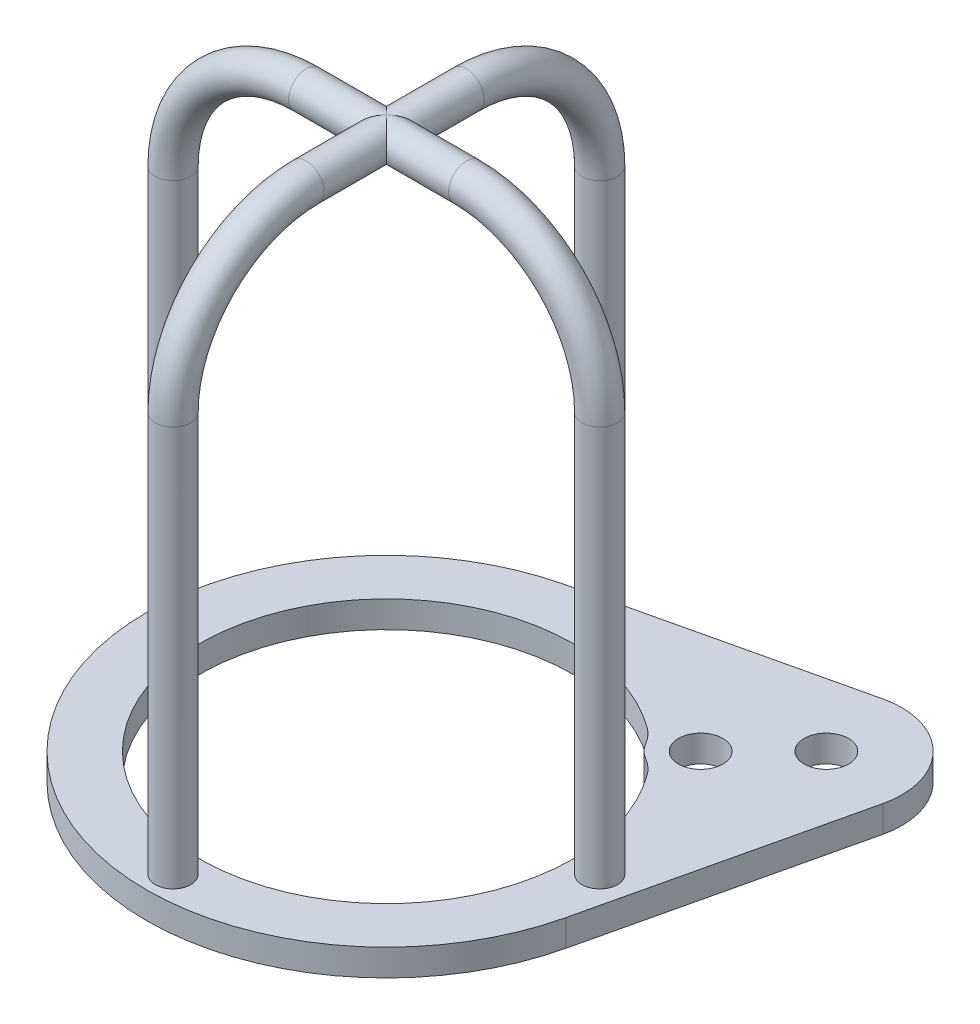
ISO-10303-21;
HEADER;
FILE_DESCRIPTION(('STEP AP214'),'2;1');
FILE_NAME('part.step','',(''),(''),'','','');
FILE_SCHEMA(('AUTOMOTIVE_DESIGN { 1 0 10303 214 1 1 1 1 }'));
ENDSEC;
DATA;
#1=APPLICATION_CONTEXT('core data for automotive mechanical design processes');
#2=APPLICATION_PROTOCOL_DEFINITION('international standard','automotive_design',2000,#1);
#3=PRODUCT_CONTEXT('',#1,'mechanical');
#4=PRODUCT('Part','Part','',(#3));
#5=PRODUCT_RELATED_PRODUCT_CATEGORY('part','',(#4));
#6=PRODUCT_DEFINITION_FORMATION('','',#4);
#7=PRODUCT_DEFINITION_CONTEXT('part definition',#1,'design');
#8=PRODUCT_DEFINITION('design','',#6,#7);
#9=PRODUCT_DEFINITION_SHAPE('','',#8);
#10=(LENGTH_UNIT() NAMED_UNIT(*) SI_UNIT(.MILLI.,.METRE.));
#11=(NAMED_UNIT(*) PLANE_ANGLE_UNIT() SI_UNIT($,.RADIAN.));
#12=(NAMED_UNIT(*) SI_UNIT($,.STERADIAN.) SOLID_ANGLE_UNIT());
#13=UNCERTAINTY_MEASURE_WITH_UNIT(LENGTH_MEASURE(1.E-05),#10,'distance_accuracy_value','');
#14=(GEOMETRIC_REPRESENTATION_CONTEXT(3) GLOBAL_UNCERTAINTY_ASSIGNED_CONTEXT((#13)) GLOBAL_UNIT_ASSIGNED_CONTEXT((#10,
#11,#12)) REPRESENTATION_CONTEXT('',''));
#15=CARTESIAN_POINT('',(0.,0.,0.));
#16=DIRECTION('',(0.,0.,1.));
#17=DIRECTION('',(1.,0.,0.));
#18=AXIS2_PLACEMENT_3D('',#15,#16,#17);
#19=CARTESIAN_POINT('',(0.,60.,0.));
#20=DIRECTION('',(1.,0.,0.));
#21=DIRECTION('',(0.,0.,-1.));
#22=AXIS2_PLACEMENT_3D('',#19,#20,#21);
#23=CYLINDRICAL_SURFACE('',#22,2.);
#24=CARTESIAN_POINT('',(-9.00000000000001,60.,0.));
#25=DIRECTION('',(1.,0.,0.));
#26=DIRECTION('',(0.,0.,-1.));
#27=AXIS2_PLACEMENT_3D('',#24,#25,#26);
#28=CIRCLE('',#27,2.);
#29=CARTESIAN_POINT('',(-9.00000000000001,62.,0.));
#30=VERTEX_POINT('',#29);
#31=EDGE_CURVE('E147',#30,#30,#28,.T.);
#32=ORIENTED_EDGE('',*,*,#31,.T.);
#33=EDGE_LOOP('',(#32));
#34=FACE_BOUND('',#33,.T.);
#35=CARTESIAN_POINT('',(0.,60.,0.));
#36=DIRECTION('',(0.707106781186551,0.,-0.707106781186544));
#37=DIRECTION('',(0.707106781186544,0.,0.707106781186551));
#38=AXIS2_PLACEMENT_3D('',#35,#36,#37);
#39=ELLIPSE('',#38,2.82842712474618,2.);
#40=CARTESIAN_POINT('',(0.,58.,0.));
#41=VERTEX_POINT('',#40);
#42=CARTESIAN_POINT('',(0.,62.,0.));
#43=VERTEX_POINT('',#42);
#44=EDGE_CURVE('E182',#41,#43,#39,.T.);
#45=ORIENTED_EDGE('',*,*,#44,.F.);
#46=CARTESIAN_POINT('',(0.,60.,0.));
#47=DIRECTION('',(0.707106781186546,0.,0.707106781186549));
#48=DIRECTION('',(-0.707106781186549,0.,0.707106781186546));
#49=AXIS2_PLACEMENT_3D('',#46,#47,#48);
#50=ELLIPSE('',#49,2.8284271247462,2.);
#51=EDGE_CURVE('E154',#41,#43,#50,.F.);
#52=ORIENTED_EDGE('',*,*,#51,.T.);
#53=EDGE_LOOP('',(#45,#52));
#54=FACE_BOUND('',#53,.T.);
#55=ADVANCED_FACE('F36',(#34,#54),#23,.T.);
#56=CARTESIAN_POINT('',(9.00000000000001,60.,0.));
#57=DIRECTION('',(-1.,0.,0.));
#58=DIRECTION('',(0.,0.,1.));
#59=AXIS2_PLACEMENT_3D('',#56,#57,#58);
#60=CIRCLE('',#59,2.);
#61=CARTESIAN_POINT('',(9.00000000000001,62.,0.));
#62=VERTEX_POINT('',#61);
#63=EDGE_CURVE('E166',#62,#62,#60,.T.);
#64=ORIENTED_EDGE('',*,*,#63,.T.);
#65=EDGE_LOOP('',(#64));
#66=FACE_BOUND('',#65,.T.);
#67=CARTESIAN_POINT('',(0.,60.,0.));
#68=DIRECTION('',(0.707106781186544,0.,0.707106781186551));
#69=DIRECTION('',(0.707106781186551,0.,-0.707106781186544));
#70=AXIS2_PLACEMENT_3D('',#67,#68,#69);
#71=ELLIPSE('',#70,2.82842712474621,2.);
#72=EDGE_CURVE('E179',#43,#41,#71,.F.);
#73=ORIENTED_EDGE('',*,*,#72,.F.);
#74=CARTESIAN_POINT('',(0.,60.,0.));
#75=DIRECTION('',(0.707106781186549,0.,-0.707106781186546));
#76=DIRECTION('',(0.707106781186546,0.,0.707106781186549));
#77=AXIS2_PLACEMENT_3D('',#74,#75,#76);
#78=ELLIPSE('',#77,2.82842712474619,2.);
#79=EDGE_CURVE('E174',#41,#43,#78,.F.);
#80=ORIENTED_EDGE('',*,*,#79,.F.);
#81=EDGE_LOOP('',(#73,#80));
#82=FACE_BOUND('',#81,.T.);
#83=ADVANCED_FACE('F261',(#66,#82),#23,.T.);
#84=CARTESIAN_POINT('',(0.,60.,0.));
#85=DIRECTION('',(0.,0.,1.));
#86=DIRECTION('',(1.,0.,0.));
#87=AXIS2_PLACEMENT_3D('',#84,#85,#86);
#88=CYLINDRICAL_SURFACE('',#87,2.);
#89=CARTESIAN_POINT('',(0.,60.,9.00000000000001));
#90=DIRECTION('',(0.,0.,-1.));
#91=DIRECTION('',(-1.,0.,0.));
#92=AXIS2_PLACEMENT_3D('',#89,#90,#91);
#93=CIRCLE('',#92,2.);
#94=CARTESIAN_POINT('',(0.,62.,9.00000000000001));
#95=VERTEX_POINT('',#94);
#96=EDGE_CURVE('E160',#95,#95,#93,.T.);
#97=ORIENTED_EDGE('',*,*,#96,.T.);
#98=EDGE_LOOP('',(#97));
#99=FACE_BOUND('',#98,.T.);
#100=ORIENTED_EDGE('',*,*,#51,.F.);
#101=ORIENTED_EDGE('',*,*,#79,.T.);
#102=EDGE_LOOP('',(#100,#101));
#103=FACE_BOUND('',#102,.T.);
#104=ADVANCED_FACE('F267',(#99,#103),#88,.T.);
#105=CARTESIAN_POINT('',(9.,45.,0.));
#106=DIRECTION('',(0.,0.,-1.));
#107=DIRECTION('',(-1.,0.,0.));
#108=AXIS2_PLACEMENT_3D('',#105,#106,#107);
#109=TOROIDAL_SURFACE('',#108,15.,2.);
#110=CARTESIAN_POINT('',(24.,45.,0.));
#111=DIRECTION('',(0.,1.,0.));
#112=DIRECTION('',(0.,0.,1.));
#113=AXIS2_PLACEMENT_3D('',#110,#111,#112);
#114=CIRCLE('',#113,2.);
#115=CARTESIAN_POINT('',(26.,45.,0.));
#116=VERTEX_POINT('',#115);
#117=EDGE_CURVE('E171',#116,#116,#114,.T.);
#118=CARTESIAN_POINT('',(9.,45.,0.));
#119=DIRECTION('',(0.,0.,-1.));
#120=DIRECTION('',(-1.,0.,0.));
#121=AXIS2_PLACEMENT_3D('',#118,#119,#120);
#122=CIRCLE('',#121,17.);
#123=EDGE_CURVE('',#62,#116,#122,.T.);
#124=ORIENTED_EDGE('',*,*,#63,.F.);
#125=ORIENTED_EDGE('',*,*,#117,.T.);
#126=ORIENTED_EDGE('',*,*,#123,.T.);
#127=ORIENTED_EDGE('',*,*,#123,.F.);
#128=EDGE_LOOP('',(#124,#126,#125,#127));
#129=FACE_BOUND('',#128,.T.);
#130=ADVANCED_FACE('F274',(#129),#109,.T.);
#131=CARTESIAN_POINT('',(24.,45.,0.));
#132=DIRECTION('',(0.,-1.,0.));
#133=DIRECTION('',(1.,0.,0.));
#134=AXIS2_PLACEMENT_3D('',#131,#132,#133);
#135=CYLINDRICAL_SURFACE('',#134,2.);
#136=CARTESIAN_POINT('',(24.,0.,0.));
#137=DIRECTION('',(0.,1.,0.));
#138=DIRECTION('',(0.,0.,1.));
#139=AXIS2_PLACEMENT_3D('',#136,#137,#138);
#140=CIRCLE('',#139,2.);
#141=CARTESIAN_POINT('',(26.,0.,0.));
#142=VERTEX_POINT('',#141);
#143=EDGE_CURVE('E145',#142,#142,#140,.T.);
#144=CARTESIAN_POINT('',(26.,0.,0.));
#145=CARTESIAN_POINT('',(26.,0.468749999999993,0.));
#146=CARTESIAN_POINT('',(26.,0.937499999999992,0.));
#147=CARTESIAN_POINT('',(26.,1.87499999999999,0.));
#148=CARTESIAN_POINT('',(26.,2.34374999999999,0.));
#149=CARTESIAN_POINT('',(26.,3.28124999999999,0.));
#150=CARTESIAN_POINT('',(26.,3.74999999999999,0.));
#151=CARTESIAN_POINT('',(26.,4.68749999999999,0.));
#152=CARTESIAN_POINT('',(26.,5.15624999999999,0.));
#153=CARTESIAN_POINT('',(26.,6.09374999999999,0.));
#154=CARTESIAN_POINT('',(26.,6.56249999999999,0.));
#155=CARTESIAN_POINT('',(26.,7.5,0.));
#156=CARTESIAN_POINT('',(26.,7.96874999999999,0.));
#157=CARTESIAN_POINT('',(26.,8.90624999999999,0.));
#158=CARTESIAN_POINT('',(26.,9.37499999999999,0.));
#159=CARTESIAN_POINT('',(26.,10.3125,0.));
#160=CARTESIAN_POINT('',(26.,10.78125,0.));
#161=CARTESIAN_POINT('',(26.,11.71875,0.));
#162=CARTESIAN_POINT('',(26.,12.1875,0.));
#163=CARTESIAN_POINT('',(26.,13.125,0.));
#164=CARTESIAN_POINT('',(26.,13.59375,0.));
#165=CARTESIAN_POINT('',(26.,14.53125,0.));
#166=CARTESIAN_POINT('',(26.,15.,0.));
#167=CARTESIAN_POINT('',(26.,15.9375,0.));
#168=CARTESIAN_POINT('',(26.,16.40625,0.));
#169=CARTESIAN_POINT('',(26.,17.34375,0.));
#170=CARTESIAN_POINT('',(26.,17.8125,0.));
#171=CARTESIAN_POINT('',(26.,18.75,0.));
#172=CARTESIAN_POINT('',(26.,19.21875,0.));
#173=CARTESIAN_POINT('',(26.,20.15625,0.));
#174=CARTESIAN_POINT('',(26.,20.625,0.));
#175=CARTESIAN_POINT('',(26.,21.5625,0.));
#176=CARTESIAN_POINT('',(26.,22.03125,0.));
#177=CARTESIAN_POINT('',(26.,22.96875,0.));
#178=CARTESIAN_POINT('',(26.,23.4375,0.));
#179=CARTESIAN_POINT('',(26.,24.375,0.));
#180=CARTESIAN_POINT('',(26.,24.84375,0.));
#181=CARTESIAN_POINT('',(26.,25.78125,0.));
#182=CARTESIAN_POINT('',(26.,26.25,0.));
#183=CARTESIAN_POINT('',(26.,27.1875,0.));
#184=CARTESIAN_POINT('',(26.,27.65625,0.));
#185=CARTESIAN_POINT('',(26.,28.59375,0.));
#186=CARTESIAN_POINT('',(26.,29.0625,0.));
#187=CARTESIAN_POINT('',(26.,30.,0.));
#188=CARTESIAN_POINT('',(26.,30.46875,0.));
#189=CARTESIAN_POINT('',(26.,31.40625,0.));
#190=CARTESIAN_POINT('',(26.,31.875,0.));
#191=CARTESIAN_POINT('',(26.,32.8125,0.));
#192=CARTESIAN_POINT('',(26.,33.28125,0.));
#193=CARTESIAN_POINT('',(26.,34.21875,0.));
#194=CARTESIAN_POINT('',(26.,34.6875,0.));
#195=CARTESIAN_POINT('',(26.,35.625,0.));
#196=CARTESIAN_POINT('',(26.,36.09375,0.));
#197=CARTESIAN_POINT('',(26.,37.03125,0.));
#198=CARTESIAN_POINT('',(26.,37.5,0.));
#199=CARTESIAN_POINT('',(26.,38.4375,0.));
#200=CARTESIAN_POINT('',(26.,38.90625,0.));
#201=CARTESIAN_POINT('',(26.,39.84375,0.));
#202=CARTESIAN_POINT('',(26.,40.3125,0.));
#203=CARTESIAN_POINT('',(26.,41.25,0.));
#204=CARTESIAN_POINT('',(26.,41.71875,0.));
#205=CARTESIAN_POINT('',(26.,42.65625,0.));
#206=CARTESIAN_POINT('',(26.,43.125,0.));
#207=CARTESIAN_POINT('',(26.,44.0625,0.));
#208=CARTESIAN_POINT('',(26.,44.53125,0.));
#209=CARTESIAN_POINT('',(26.,45.,0.));
#210=B_SPLINE_CURVE_WITH_KNOTS('',3,(#144,#145,#146,#147,#148,#149,#150,#151,#152,#153,#154,
#155,#156,#157,#158,#159,#160,#161,#162,#163,#164,#165,#166,#167,#168,#169,#170,#171,#172,#173,
#174,#175,#176,#177,#178,#179,#180,#181,#182,#183,#184,#185,#186,#187,#188,#189,#190,#191,#192,
#193,#194,#195,#196,#197,#198,#199,#200,#201,#202,#203,#204,#205,#206,#207,#208,#209),
.UNSPECIFIED.,.F.,.F.,(4,2,2,2,2,2,2,2,2,2,2,2,2,2,2,2,2,2,2,2,2,2,2,2,2,2,2,2,2,2,2,2,4),(0.,
1.40625,2.8125,4.21875,5.625,7.03125,8.4375,9.84375,11.25,12.65625,14.0625,15.46875,16.875,
18.28125,19.6875,21.09375,22.5,23.90625,25.3125,26.71875,28.125,29.53125,30.9375,32.34375,33.75,
35.15625,36.5625,37.96875,39.375,40.78125,42.1875,43.59375,45.),.UNSPECIFIED.);
#211=EDGE_CURVE('BSEAM277',#142,#116,#210,.T.);
#212=ORIENTED_EDGE('',*,*,#143,.T.);
#213=ORIENTED_EDGE('',*,*,#117,.F.);
#214=ORIENTED_EDGE('',*,*,#211,.T.);
#215=ORIENTED_EDGE('',*,*,#211,.F.);
#216=EDGE_LOOP('',(#212,#214,#213,#215));
#217=FACE_BOUND('',#216,.T.);
#218=ADVANCED_FACE('F277',(#217),#135,.T.);
#219=CARTESIAN_POINT('',(0.,45.,9.));
#220=DIRECTION('',(1.,0.,0.));
#221=DIRECTION('',(0.,0.,-1.));
#222=AXIS2_PLACEMENT_3D('',#219,#220,#221);
#223=TOROIDAL_SURFACE('',#222,15.,2.);
#224=CARTESIAN_POINT('',(0.,45.,24.));
#225=DIRECTION('',(0.,1.,0.));
#226=DIRECTION('',(-1.,0.,0.));
#227=AXIS2_PLACEMENT_3D('',#224,#225,#226);
#228=CIRCLE('',#227,2.);
#229=CARTESIAN_POINT('',(0.,45.,26.));
#230=VERTEX_POINT('',#229);
#231=EDGE_CURVE('E163',#230,#230,#228,.T.);
#232=CARTESIAN_POINT('',(0.,45.,9.));
#233=DIRECTION('',(1.,0.,0.));
#234=DIRECTION('',(0.,0.,-1.));
#235=AXIS2_PLACEMENT_3D('',#232,#233,#234);
#236=CIRCLE('',#235,17.);
#237=EDGE_CURVE('',#95,#230,#236,.T.);
#238=ORIENTED_EDGE('',*,*,#96,.F.);
#239=ORIENTED_EDGE('',*,*,#231,.T.);
#240=ORIENTED_EDGE('',*,*,#237,.T.);
#241=ORIENTED_EDGE('',*,*,#237,.F.);
#242=EDGE_LOOP('',(#238,#240,#239,#241));
#243=FACE_BOUND('',#242,.T.);
#244=ADVANCED_FACE('F280',(#243),#223,.T.);
#245=CARTESIAN_POINT('',(0.,45.,24.));
#246=DIRECTION('',(0.,-1.,0.));
#247=DIRECTION('',(0.,0.,-1.));
#248=AXIS2_PLACEMENT_3D('',#245,#246,#247);
#249=CYLINDRICAL_SURFACE('',#248,2.);
#250=CARTESIAN_POINT('',(0.,0.,24.));
#251=DIRECTION('',(0.,1.,0.));
#252=DIRECTION('',(-1.,0.,0.));
#253=AXIS2_PLACEMENT_3D('',#250,#251,#252);
#254=CIRCLE('',#253,2.);
#255=CARTESIAN_POINT('',(-2.00000000000009,0.,24.));
#256=VERTEX_POINT('',#255);
#257=EDGE_CURVE('E157',#256,#256,#254,.T.);
#258=ORIENTED_EDGE('',*,*,#257,.T.);
#259=EDGE_LOOP('',(#258));
#260=FACE_BOUND('',#259,.T.);
#261=ORIENTED_EDGE('',*,*,#231,.F.);
#262=EDGE_LOOP('',(#261));
#263=FACE_BOUND('',#262,.T.);
#264=ADVANCED_FACE('F272',(#260,#263),#249,.T.);
#265=CARTESIAN_POINT('',(-9.,45.,0.));
#266=DIRECTION('',(0.,0.,1.));
#267=DIRECTION('',(1.,0.,0.));
#268=AXIS2_PLACEMENT_3D('',#265,#266,#267);
#269=TOROIDAL_SURFACE('',#268,15.,2.);
#270=CARTESIAN_POINT('',(-24.,45.,0.));
#271=DIRECTION('',(0.,1.,0.));
#272=DIRECTION('',(0.,0.,-1.));
#273=AXIS2_PLACEMENT_3D('',#270,#271,#272);
#274=CIRCLE('',#273,2.);
#275=CARTESIAN_POINT('',(-26.,45.,0.));
#276=VERTEX_POINT('',#275);
#277=EDGE_CURVE('E151',#276,#276,#274,.T.);
#278=CARTESIAN_POINT('',(-9.,45.,0.));
#279=DIRECTION('',(0.,0.,1.));
#280=DIRECTION('',(1.,0.,0.));
#281=AXIS2_PLACEMENT_3D('',#278,#279,#280);
#282=CIRCLE('',#281,17.);
#283=EDGE_CURVE('',#30,#276,#282,.T.);
#284=ORIENTED_EDGE('',*,*,#31,.F.);
#285=ORIENTED_EDGE('',*,*,#277,.T.);
#286=ORIENTED_EDGE('',*,*,#283,.T.);
#287=ORIENTED_EDGE('',*,*,#283,.F.);
#288=EDGE_LOOP('',(#284,#286,#285,#287));
#289=FACE_BOUND('',#288,.T.);
#290=ADVANCED_FACE('F316',(#289),#269,.T.);
#291=CARTESIAN_POINT('',(-24.,45.,0.));
#292=DIRECTION('',(0.,-1.,0.));
#293=DIRECTION('',(1.,0.,0.));
#294=AXIS2_PLACEMENT_3D('',#291,#292,#293);
#295=CYLINDRICAL_SURFACE('',#294,2.);
#296=CARTESIAN_POINT('',(-24.,0.,0.));
#297=DIRECTION('',(0.,1.,0.));
#298=DIRECTION('',(0.,0.,-1.));
#299=AXIS2_PLACEMENT_3D('',#296,#297,#298);
#300=CIRCLE('',#299,2.);
#301=CARTESIAN_POINT('',(-24.,0.,-2.));
#302=VERTEX_POINT('',#301);
#303=EDGE_CURVE('E135',#302,#302,#300,.T.);
#304=ORIENTED_EDGE('',*,*,#303,.T.);
#305=EDGE_LOOP('',(#304));
#306=FACE_BOUND('',#305,.T.);
#307=ORIENTED_EDGE('',*,*,#277,.F.);
#308=EDGE_LOOP('',(#307));
#309=FACE_BOUND('',#308,.T.);
#310=ADVANCED_FACE('F313',(#306,#309),#295,.T.);
#311=CARTESIAN_POINT('',(0.,60.,0.));
#312=DIRECTION('',(0.,0.,-1.));
#313=DIRECTION('',(-1.,0.,0.));
#314=AXIS2_PLACEMENT_3D('',#311,#312,#313);
#315=CYLINDRICAL_SURFACE('',#314,2.);
#316=CARTESIAN_POINT('',(0.,60.,-9.00000000000001));
#317=DIRECTION('',(0.,0.,1.));
#318=DIRECTION('',(1.,0.,0.));
#319=AXIS2_PLACEMENT_3D('',#316,#317,#318);
#320=CIRCLE('',#319,2.);
#321=CARTESIAN_POINT('',(0.,62.,-9.00000000000001));
#322=VERTEX_POINT('',#321);
#323=EDGE_CURVE('E141',#322,#322,#320,.T.);
#324=ORIENTED_EDGE('',*,*,#323,.T.);
#325=EDGE_LOOP('',(#324));
#326=FACE_BOUND('',#325,.T.);
#327=ORIENTED_EDGE('',*,*,#72,.T.);
#328=ORIENTED_EDGE('',*,*,#44,.T.);
#329=EDGE_LOOP('',(#327,#328));
#330=FACE_BOUND('',#329,.T.);
#331=ADVANCED_FACE('F303',(#326,#330),#315,.T.);
#332=CARTESIAN_POINT('',(0.,45.,-9.));
#333=DIRECTION('',(-1.,0.,0.));
#334=DIRECTION('',(0.,0.,1.));
#335=AXIS2_PLACEMENT_3D('',#332,#333,#334);
#336=TOROIDAL_SURFACE('',#335,15.,2.);
#337=CARTESIAN_POINT('',(2.51386656396706E-13,45.,-24.));
#338=DIRECTION('',(0.,1.,0.));
#339=DIRECTION('',(1.,0.,0.));
#340=AXIS2_PLACEMENT_3D('',#337,#338,#339);
#341=CIRCLE('',#340,2.);
#342=CARTESIAN_POINT('',(2.72335544429764E-13,45.,-26.));
#343=VERTEX_POINT('',#342);
#344=EDGE_CURVE('E144',#343,#343,#341,.T.);
#345=CARTESIAN_POINT('',(0.,45.,-9.));
#346=DIRECTION('',(-1.,0.,0.));
#347=DIRECTION('',(0.,0.,1.));
#348=AXIS2_PLACEMENT_3D('',#345,#346,#347);
#349=CIRCLE('',#348,17.);
#350=EDGE_CURVE('',#322,#343,#349,.T.);
#351=ORIENTED_EDGE('',*,*,#323,.F.);
#352=ORIENTED_EDGE('',*,*,#344,.T.);
#353=ORIENTED_EDGE('',*,*,#350,.T.);
#354=ORIENTED_EDGE('',*,*,#350,.F.);
#355=EDGE_LOOP('',(#351,#353,#352,#354));
#356=FACE_BOUND('',#355,.T.);
#357=ADVANCED_FACE('F294',(#356),#336,.T.);
#358=CARTESIAN_POINT('',(2.51386656396706E-13,45.,-24.));
#359=DIRECTION('',(0.,-1.,0.));
#360=DIRECTION('',(0.,0.,-1.));
#361=AXIS2_PLACEMENT_3D('',#358,#359,#360);
#362=CYLINDRICAL_SURFACE('',#361,2.);
#363=CARTESIAN_POINT('',(2.51386656396706E-13,0.,-24.));
#364=DIRECTION('',(0.,1.,0.));
#365=DIRECTION('',(1.,0.,0.));
#366=AXIS2_PLACEMENT_3D('',#363,#364,#365);
#367=CIRCLE('',#366,2.);
#368=CARTESIAN_POINT('',(2.51386656396706E-13,0.,-26.));
#369=VERTEX_POINT('',#368);
#370=EDGE_CURVE('E132',#369,#369,#367,.T.);
#371=CARTESIAN_POINT('',(2.51386656396706E-13,0.,-26.));
#372=CARTESIAN_POINT('',(2.51386656396706E-13,0.468749999999993,-26.));
#373=CARTESIAN_POINT('',(2.51386656396706E-13,0.937499999999992,-26.));
#374=CARTESIAN_POINT('',(2.51386656396706E-13,1.87499999999999,-26.));
#375=CARTESIAN_POINT('',(2.51386656396706E-13,2.34374999999999,-26.));
#376=CARTESIAN_POINT('',(2.51386656396706E-13,3.28124999999999,-26.));
#377=CARTESIAN_POINT('',(2.51386656396706E-13,3.74999999999999,-26.));
#378=CARTESIAN_POINT('',(2.51386656396706E-13,4.68749999999999,-26.));
#379=CARTESIAN_POINT('',(2.51386656396706E-13,5.15624999999999,-26.));
#380=CARTESIAN_POINT('',(2.51386656396706E-13,6.09374999999999,-26.));
#381=CARTESIAN_POINT('',(2.51386656396706E-13,6.56249999999999,-26.));
#382=CARTESIAN_POINT('',(2.51386656396706E-13,7.5,-26.));
#383=CARTESIAN_POINT('',(2.51386656396706E-13,7.96874999999999,-26.));
#384=CARTESIAN_POINT('',(2.51386656396706E-13,8.90624999999999,-26.));
#385=CARTESIAN_POINT('',(2.51386656396706E-13,9.37499999999999,-26.));
#386=CARTESIAN_POINT('',(2.51386656396706E-13,10.3125,-26.));
#387=CARTESIAN_POINT('',(2.51386656396706E-13,10.78125,-26.));
#388=CARTESIAN_POINT('',(2.51386656396706E-13,11.71875,-26.));
#389=CARTESIAN_POINT('',(2.51386656396706E-13,12.1875,-26.));
#390=CARTESIAN_POINT('',(2.51386656396706E-13,13.125,-26.));
#391=CARTESIAN_POINT('',(2.51386656396706E-13,13.59375,-26.));
#392=CARTESIAN_POINT('',(2.51386656396706E-13,14.53125,-26.));
#393=CARTESIAN_POINT('',(2.51386656396706E-13,15.,-26.));
#394=CARTESIAN_POINT('',(2.51386656396706E-13,15.9375,-26.));
#395=CARTESIAN_POINT('',(2.51386656396706E-13,16.40625,-26.));
#396=CARTESIAN_POINT('',(2.51386656396706E-13,17.34375,-26.));
#397=CARTESIAN_POINT('',(2.51386656396706E-13,17.8125,-26.));
#398=CARTESIAN_POINT('',(2.51386656396706E-13,18.75,-26.));
#399=CARTESIAN_POINT('',(2.51386656396706E-13,19.21875,-26.));
#400=CARTESIAN_POINT('',(2.51386656396706E-13,20.15625,-26.));
#401=CARTESIAN_POINT('',(2.51386656396706E-13,20.625,-26.));
#402=CARTESIAN_POINT('',(2.51386656396706E-13,21.5625,-26.));
#403=CARTESIAN_POINT('',(2.51386656396706E-13,22.03125,-26.));
#404=CARTESIAN_POINT('',(2.51386656396706E-13,22.96875,-26.));
#405=CARTESIAN_POINT('',(2.51386656396706E-13,23.4375,-26.));
#406=CARTESIAN_POINT('',(2.51386656396706E-13,24.375,-26.));
#407=CARTESIAN_POINT('',(2.51386656396706E-13,24.84375,-26.));
#408=CARTESIAN_POINT('',(2.51386656396706E-13,25.78125,-26.));
#409=CARTESIAN_POINT('',(2.51386656396706E-13,26.25,-26.));
#410=CARTESIAN_POINT('',(2.51386656396706E-13,27.1875,-26.));
#411=CARTESIAN_POINT('',(2.51386656396706E-13,27.65625,-26.));
#412=CARTESIAN_POINT('',(2.51386656396706E-13,28.59375,-26.));
#413=CARTESIAN_POINT('',(2.51386656396706E-13,29.0625,-26.));
#414=CARTESIAN_POINT('',(2.51386656396706E-13,30.,-26.));
#415=CARTESIAN_POINT('',(2.51386656396706E-13,30.46875,-26.));
#416=CARTESIAN_POINT('',(2.51386656396706E-13,31.40625,-26.));
#417=CARTESIAN_POINT('',(2.51386656396706E-13,31.875,-26.));
#418=CARTESIAN_POINT('',(2.51386656396706E-13,32.8125,-26.));
#419=CARTESIAN_POINT('',(2.51386656396706E-13,33.28125,-26.));
#420=CARTESIAN_POINT('',(2.51386656396706E-13,34.21875,-26.));
#421=CARTESIAN_POINT('',(2.51386656396706E-13,34.6875,-26.));
#422=CARTESIAN_POINT('',(2.51386656396706E-13,35.625,-26.));
#423=CARTESIAN_POINT('',(2.51386656396706E-13,36.09375,-26.));
#424=CARTESIAN_POINT('',(2.51386656396706E-13,37.03125,-26.));
#425=CARTESIAN_POINT('',(2.51386656396706E-13,37.5,-26.));
#426=CARTESIAN_POINT('',(2.51386656396706E-13,38.4375,-26.));
#427=CARTESIAN_POINT('',(2.51386656396706E-13,38.90625,-26.));
#428=CARTESIAN_POINT('',(2.51386656396706E-13,39.84375,-26.));
#429=CARTESIAN_POINT('',(2.51386656396706E-13,40.3125,-26.));
#430=CARTESIAN_POINT('',(2.51386656396706E-13,41.25,-26.));
#431=CARTESIAN_POINT('',(2.51386656396706E-13,41.71875,-26.));
#432=CARTESIAN_POINT('',(2.51386656396706E-13,42.65625,-26.));
#433=CARTESIAN_POINT('',(2.51386656396706E-13,43.125,-26.));
#434=CARTESIAN_POINT('',(2.51386656396706E-13,44.0625,-26.));
#435=CARTESIAN_POINT('',(2.51386656396706E-13,44.53125,-26.));
#436=CARTESIAN_POINT('',(2.51386656396706E-13,45.,-26.));
#437=B_SPLINE_CURVE_WITH_KNOTS('',3,(#371,#372,#373,#374,#375,#376,#377,#378,#379,#380,#381,
#382,#383,#384,#385,#386,#387,#388,#389,#390,#391,#392,#393,#394,#395,#396,#397,#398,#399,#400,
#401,#402,#403,#404,#405,#406,#407,#408,#409,#410,#411,#412,#413,#414,#415,#416,#417,#418,#419,
#420,#421,#422,#423,#424,#425,#426,#427,#428,#429,#430,#431,#432,#433,#434,#435,#436),
.UNSPECIFIED.,.F.,.F.,(4,2,2,2,2,2,2,2,2,2,2,2,2,2,2,2,2,2,2,2,2,2,2,2,2,2,2,2,2,2,2,2,4),(0.,
1.40625,2.8125,4.21875,5.625,7.03125,8.4375,9.84375,11.25,12.65625,14.0625,15.46875,16.875,
18.28125,19.6875,21.09375,22.5,23.90625,25.3125,26.71875,28.125,29.53125,30.9375,32.34375,33.75,
35.15625,36.5625,37.96875,39.375,40.78125,42.1875,43.59375,45.),.UNSPECIFIED.);
#438=EDGE_CURVE('BSEAM291',#369,#343,#437,.T.);
#439=ORIENTED_EDGE('',*,*,#370,.T.);
#440=ORIENTED_EDGE('',*,*,#344,.F.);
#441=ORIENTED_EDGE('',*,*,#438,.T.);
#442=ORIENTED_EDGE('',*,*,#438,.F.);
#443=EDGE_LOOP('',(#439,#441,#440,#442));
#444=FACE_BOUND('',#443,.T.);
#445=ADVANCED_FACE('F291',(#444),#362,.T.);
#446=CARTESIAN_POINT('',(24.7487373415292,-3.00000000000001,-24.7487373415291));
#447=DIRECTION('',(0.,1.,0.));
#448=DIRECTION('',(-1.,0.,0.));
#449=AXIS2_PLACEMENT_3D('',#446,#447,#448);
#450=PLANE('',#449);
#451=CARTESIAN_POINT('',(24.7487373415292,-3.00000000000001,-24.7487373415291));
#452=DIRECTION('',(0.,-1.,0.));
#453=DIRECTION('',(1.,0.,0.));
#454=AXIS2_PLACEMENT_3D('',#451,#452,#453);
#455=CIRCLE('',#454,2.5);
#456=CARTESIAN_POINT('',(27.2487373415292,-3.00000000000002,-24.7487373415291));
#457=VERTEX_POINT('',#456);
#458=EDGE_CURVE('E221',#457,#457,#455,.T.);
#459=ORIENTED_EDGE('',*,*,#458,.F.);
#460=EDGE_LOOP('',(#459));
#461=FACE_BOUND('',#460,.T.);
#462=CARTESIAN_POINT('',(17.6776695296637,-3.00000000000001,-17.6776695296637));
#463=DIRECTION('',(0.,-1.,0.));
#464=DIRECTION('',(1.,0.,0.));
#465=AXIS2_PLACEMENT_3D('',#462,#463,#464);
#466=CIRCLE('',#465,2.5);
#467=CARTESIAN_POINT('',(20.1776695296637,-3.00000000000001,-17.6776695296637));
#468=VERTEX_POINT('',#467);
#469=EDGE_CURVE('E227',#468,#468,#466,.T.);
#470=ORIENTED_EDGE('',*,*,#469,.F.);
#471=EDGE_LOOP('',(#470));
#472=FACE_BOUND('',#471,.T.);
#473=CARTESIAN_POINT('',(24.7487373415292,-3.00000000000001,-24.7487373415291));
#474=DIRECTION('',(0.,-1.,0.));
#475=DIRECTION('',(-1.,0.,0.));
#476=AXIS2_PLACEMENT_3D('',#473,#474,#475);
#477=CIRCLE('',#476,8.5);
#478=CARTESIAN_POINT('',(22.8234991875656,-3.00000000000001,-33.0278350007262));
#479=VERTEX_POINT('',#478);
#480=CARTESIAN_POINT('',(33.0278350007263,-3.00000000000002,-22.8234991875654));
#481=VERTEX_POINT('',#480);
#482=EDGE_CURVE('E118',#479,#481,#477,.T.);
#483=ORIENTED_EDGE('',*,*,#482,.T.);
#484=DIRECTION('',(-0.22649860634867,0.,0.974011489317303));
#485=VECTOR('',#484,1.);
#486=CARTESIAN_POINT('',(26.2983102115672,-3.00000000000002,6.11546237141407));
#487=LINE('',#486,#485);
#488=CARTESIAN_POINT('',(26.2983102115672,-3.00000000000002,6.11546237141407));
#489=VERTEX_POINT('',#488);
#490=EDGE_CURVE('E107',#481,#489,#487,.T.);
#491=ORIENTED_EDGE('',*,*,#490,.T.);
#492=CARTESIAN_POINT('',(0.,-3.,0.));
#493=DIRECTION('',(0.,-1.,0.));
#494=DIRECTION('',(1.,0.,0.));
#495=AXIS2_PLACEMENT_3D('',#492,#493,#494);
#496=CIRCLE('',#495,27.);
#497=CARTESIAN_POINT('',(-6.11546237141396,-3.,-26.2983102115672));
#498=VERTEX_POINT('',#497);
#499=EDGE_CURVE('E117',#489,#498,#496,.T.);
#500=ORIENTED_EDGE('',*,*,#499,.T.);
#501=DIRECTION('',(0.974011489317304,0.,-0.226498606348665));
#502=VECTOR('',#501,1.);
#503=CARTESIAN_POINT('',(22.8234991875656,-3.00000000000001,-33.0278350007262));
#504=LINE('',#503,#502);
#505=EDGE_CURVE('E123',#498,#479,#504,.T.);
#506=ORIENTED_EDGE('',*,*,#505,.T.);
#507=EDGE_LOOP('',(#483,#491,#500,#506));
#508=FACE_BOUND('',#507,.T.);
#509=CARTESIAN_POINT('',(0.,-3.,0.));
#510=DIRECTION('',(0.,-1.,0.));
#511=DIRECTION('',(1.,0.,0.));
#512=AXIS2_PLACEMENT_3D('',#509,#510,#511);
#513=CIRCLE('',#512,21.);
#514=CARTESIAN_POINT('',(16.9291216104544,-3.00000000000001,-12.4259744687669));
#515=VERTEX_POINT('',#514);
#516=CARTESIAN_POINT('',(12.425974468767,-3.00000000000001,-16.9291216104543));
#517=VERTEX_POINT('',#516);
#518=EDGE_CURVE('E211',#515,#517,#513,.T.);
#519=ORIENTED_EDGE('',*,*,#518,.F.);
#520=CARTESIAN_POINT('',(12.89837836987,-3.00000000000001,-9.46740911906049));
#521=DIRECTION('',(0.,1.,0.));
#522=DIRECTION('',(-1.,0.,0.));
#523=AXIS2_PLACEMENT_3D('',#520,#521,#522);
#524=CIRCLE('',#523,5.);
#525=CARTESIAN_POINT('',(15.4137947697614,-3.00000000000001,-13.7885988088516));
#526=VERTEX_POINT('',#525);
#527=EDGE_CURVE('E196',#515,#526,#524,.T.);
#528=ORIENTED_EDGE('',*,*,#527,.T.);
#529=CARTESIAN_POINT('',(17.6776695296637,-3.00000000000001,-17.6776695296637));
#530=DIRECTION('',(0.,1.,0.));
#531=DIRECTION('',(-1.,0.,0.));
#532=AXIS2_PLACEMENT_3D('',#529,#530,#531);
#533=CIRCLE('',#532,4.5);
#534=CARTESIAN_POINT('',(13.7885988088517,-3.00000000000001,-15.4137947697614));
#535=VERTEX_POINT('',#534);
#536=EDGE_CURVE('E215',#535,#526,#533,.T.);
#537=ORIENTED_EDGE('',*,*,#536,.F.);
#538=CARTESIAN_POINT('',(9.46740911906054,-3.00000000000001,-12.89837836987));
#539=DIRECTION('',(0.,1.,0.));
#540=DIRECTION('',(-1.,0.,0.));
#541=AXIS2_PLACEMENT_3D('',#538,#539,#540);
#542=CIRCLE('',#541,5.);
#543=EDGE_CURVE('E11',#535,#517,#542,.T.);
#544=ORIENTED_EDGE('',*,*,#543,.T.);
#545=EDGE_LOOP('',(#519,#528,#537,#544));
#546=FACE_BOUND('',#545,.T.);
#547=ADVANCED_FACE('F121',(#461,#472,#508,#546),#450,.F.);
#548=CARTESIAN_POINT('',(24.7487373415292,0.,-24.7487373415291));
#549=DIRECTION('',(0.,1.,0.));
#550=DIRECTION('',(-1.,0.,0.));
#551=AXIS2_PLACEMENT_3D('',#548,#549,#550);
#552=PLANE('',#551);
#553=ORIENTED_EDGE('',*,*,#143,.F.);
#554=EDGE_LOOP('',(#553));
#555=FACE_BOUND('',#554,.T.);
#556=ORIENTED_EDGE('',*,*,#257,.F.);
#557=EDGE_LOOP('',(#556));
#558=FACE_BOUND('',#557,.T.);
#559=ORIENTED_EDGE('',*,*,#303,.F.);
#560=EDGE_LOOP('',(#559));
#561=FACE_BOUND('',#560,.T.);
#562=ORIENTED_EDGE('',*,*,#370,.F.);
#563=EDGE_LOOP('',(#562));
#564=FACE_BOUND('',#563,.T.);
#565=CARTESIAN_POINT('',(17.6776695296637,0.,-17.6776695296637));
#566=DIRECTION('',(0.,-1.,0.));
#567=DIRECTION('',(1.,0.,0.));
#568=AXIS2_PLACEMENT_3D('',#565,#566,#567);
#569=CIRCLE('',#568,2.5);
#570=CARTESIAN_POINT('',(20.1776695296637,0.,-17.6776695296637));
#571=VERTEX_POINT('',#570);
#572=EDGE_CURVE('E224',#571,#571,#569,.T.);
#573=ORIENTED_EDGE('',*,*,#572,.T.);
#574=EDGE_LOOP('',(#573));
#575=FACE_BOUND('',#574,.T.);
#576=CARTESIAN_POINT('',(24.7487373415292,0.,-24.7487373415291));
#577=DIRECTION('',(0.,-1.,0.));
#578=DIRECTION('',(-1.,0.,0.));
#579=AXIS2_PLACEMENT_3D('',#576,#577,#578);
#580=CIRCLE('',#579,8.5);
#581=CARTESIAN_POINT('',(22.8234991875656,0.,-33.0278350007262));
#582=VERTEX_POINT('',#581);
#583=CARTESIAN_POINT('',(33.0278350007263,0.,-22.8234991875654));
#584=VERTEX_POINT('',#583);
#585=EDGE_CURVE('E131',#582,#584,#580,.T.);
#586=ORIENTED_EDGE('',*,*,#585,.F.);
#587=DIRECTION('',(0.974011489317304,0.,-0.226498606348665));
#588=VECTOR('',#587,1.);
#589=CARTESIAN_POINT('',(22.8234991875656,0.,-33.0278350007262));
#590=LINE('',#589,#588);
#591=CARTESIAN_POINT('',(-6.11546237141396,0.,-26.2983102115672));
#592=VERTEX_POINT('',#591);
#593=EDGE_CURVE('E127',#592,#582,#590,.T.);
#594=ORIENTED_EDGE('',*,*,#593,.F.);
#595=CARTESIAN_POINT('',(0.,0.,0.));
#596=DIRECTION('',(0.,-1.,0.));
#597=DIRECTION('',(1.,0.,0.));
#598=AXIS2_PLACEMENT_3D('',#595,#596,#597);
#599=CIRCLE('',#598,27.);
#600=CARTESIAN_POINT('',(26.2983102115672,0.,6.11546237141407));
#601=VERTEX_POINT('',#600);
#602=EDGE_CURVE('E238',#601,#592,#599,.T.);
#603=ORIENTED_EDGE('',*,*,#602,.F.);
#604=DIRECTION('',(-0.22649860634867,0.,0.974011489317303));
#605=VECTOR('',#604,1.);
#606=CARTESIAN_POINT('',(26.2983102115672,0.,6.11546237141407));
#607=LINE('',#606,#605);
#608=EDGE_CURVE('E236',#584,#601,#607,.T.);
#609=ORIENTED_EDGE('',*,*,#608,.F.);
#610=EDGE_LOOP('',(#586,#594,#603,#609));
#611=FACE_BOUND('',#610,.T.);
#612=CARTESIAN_POINT('',(24.7487373415292,0.,-24.7487373415291));
#613=DIRECTION('',(0.,-1.,0.));
#614=DIRECTION('',(1.,0.,0.));
#615=AXIS2_PLACEMENT_3D('',#612,#613,#614);
#616=CIRCLE('',#615,2.5);
#617=CARTESIAN_POINT('',(27.2487373415292,0.,-24.7487373415291));
#618=VERTEX_POINT('',#617);
#619=EDGE_CURVE('E217',#618,#618,#616,.T.);
#620=ORIENTED_EDGE('',*,*,#619,.T.);
#621=EDGE_LOOP('',(#620));
#622=FACE_BOUND('',#621,.T.);
#623=CARTESIAN_POINT('',(0.,0.,0.));
#624=DIRECTION('',(0.,-1.,0.));
#625=DIRECTION('',(1.,0.,0.));
#626=AXIS2_PLACEMENT_3D('',#623,#624,#625);
#627=CIRCLE('',#626,21.);
#628=CARTESIAN_POINT('',(16.9291216104544,0.,-12.4259744687669));
#629=VERTEX_POINT('',#628);
#630=CARTESIAN_POINT('',(12.425974468767,0.,-16.9291216104543));
#631=VERTEX_POINT('',#630);
#632=EDGE_CURVE('E203',#629,#631,#627,.T.);
#633=ORIENTED_EDGE('',*,*,#632,.T.);
#634=CARTESIAN_POINT('',(9.46740911906055,0.,-12.89837836987));
#635=DIRECTION('',(0.,1.,0.));
#636=DIRECTION('',(-1.,0.,0.));
#637=AXIS2_PLACEMENT_3D('',#634,#635,#636);
#638=CIRCLE('',#637,5.);
#639=CARTESIAN_POINT('',(13.7885988088517,0.,-15.4137947697614));
#640=VERTEX_POINT('',#639);
#641=EDGE_CURVE('E44',#631,#640,#638,.F.);
#642=ORIENTED_EDGE('',*,*,#641,.T.);
#643=CARTESIAN_POINT('',(17.6776695296637,0.,-17.6776695296637));
#644=DIRECTION('',(0.,1.,0.));
#645=DIRECTION('',(-1.,0.,0.));
#646=AXIS2_PLACEMENT_3D('',#643,#644,#645);
#647=CIRCLE('',#646,4.5);
#648=CARTESIAN_POINT('',(15.4137947697614,0.,-13.7885988088516));
#649=VERTEX_POINT('',#648);
#650=EDGE_CURVE('E202',#640,#649,#647,.T.);
#651=ORIENTED_EDGE('',*,*,#650,.T.);
#652=CARTESIAN_POINT('',(12.89837836987,0.,-9.46740911906049));
#653=DIRECTION('',(0.,1.,0.));
#654=DIRECTION('',(-1.,0.,0.));
#655=AXIS2_PLACEMENT_3D('',#652,#653,#654);
#656=CIRCLE('',#655,5.);
#657=EDGE_CURVE('E194',#649,#629,#656,.F.);
#658=ORIENTED_EDGE('',*,*,#657,.T.);
#659=EDGE_LOOP('',(#633,#642,#651,#658));
#660=FACE_BOUND('',#659,.T.);
#661=ADVANCED_FACE('F201',(#555,#558,#561,#564,#575,#611,#622,#660),#552,.T.);
#662=CARTESIAN_POINT('',(24.7487373415292,-3.00000000000001,-24.7487373415291));
#663=DIRECTION('',(0.,1.,0.));
#664=DIRECTION('',(-1.,0.,0.));
#665=AXIS2_PLACEMENT_3D('',#662,#663,#664);
#666=CYLINDRICAL_SURFACE('',#665,8.5);
#667=ORIENTED_EDGE('',*,*,#585,.T.);
#668=DIRECTION('',(0.,1.,0.));
#669=VECTOR('',#668,1.);
#670=CARTESIAN_POINT('',(33.0278350007263,-3.00000000000002,-22.8234991875654));
#671=LINE('',#670,#669);
#672=EDGE_CURVE('E111',#481,#584,#671,.T.);
#673=ORIENTED_EDGE('',*,*,#672,.F.);
#674=ORIENTED_EDGE('',*,*,#482,.F.);
#675=DIRECTION('',(0.,1.,0.));
#676=VECTOR('',#675,1.);
#677=CARTESIAN_POINT('',(22.8234991875656,-3.00000000000001,-33.0278350007262));
#678=LINE('',#677,#676);
#679=EDGE_CURVE('E234',#479,#582,#678,.T.);
#680=ORIENTED_EDGE('',*,*,#679,.T.);
#681=EDGE_LOOP('',(#667,#673,#674,#680));
#682=FACE_BOUND('',#681,.T.);
#683=ADVANCED_FACE('F129',(#682),#666,.T.);
#684=CARTESIAN_POINT('',(26.2983102115672,-3.00000000000002,6.11546237141407));
#685=DIRECTION('',(-0.974011489317303,0.,-0.22649860634867));
#686=DIRECTION('',(-0.22649860634867,0.,0.974011489317303));
#687=AXIS2_PLACEMENT_3D('',#684,#685,#686);
#688=PLANE('',#687);
#689=ORIENTED_EDGE('',*,*,#608,.T.);
#690=DIRECTION('',(0.,1.,0.));
#691=VECTOR('',#690,1.);
#692=CARTESIAN_POINT('',(26.2983102115672,-3.00000000000002,6.11546237141407));
#693=LINE('',#692,#691);
#694=EDGE_CURVE('E114',#489,#601,#693,.T.);
#695=ORIENTED_EDGE('',*,*,#694,.F.);
#696=ORIENTED_EDGE('',*,*,#490,.F.);
#697=ORIENTED_EDGE('',*,*,#672,.T.);
#698=EDGE_LOOP('',(#689,#695,#696,#697));
#699=FACE_BOUND('',#698,.T.);
#700=ADVANCED_FACE('F109',(#699),#688,.F.);
#701=CARTESIAN_POINT('',(0.,-3.,0.));
#702=DIRECTION('',(0.,1.,0.));
#703=DIRECTION('',(-1.,0.,0.));
#704=AXIS2_PLACEMENT_3D('',#701,#702,#703);
#705=CYLINDRICAL_SURFACE('',#704,27.);
#706=ORIENTED_EDGE('',*,*,#602,.T.);
#707=DIRECTION('',(0.,1.,0.));
#708=VECTOR('',#707,1.);
#709=CARTESIAN_POINT('',(-6.11546237141396,-3.,-26.2983102115672));
#710=LINE('',#709,#708);
#711=EDGE_CURVE('E137',#498,#592,#710,.T.);
#712=ORIENTED_EDGE('',*,*,#711,.F.);
#713=ORIENTED_EDGE('',*,*,#499,.F.);
#714=ORIENTED_EDGE('',*,*,#694,.T.);
#715=EDGE_LOOP('',(#706,#712,#713,#714));
#716=FACE_BOUND('',#715,.T.);
#717=ADVANCED_FACE('F250',(#716),#705,.T.);
#718=CARTESIAN_POINT('',(22.8234991875656,-3.00000000000001,-33.0278350007262));
#719=DIRECTION('',(0.226498606348665,0.,0.974011489317304));
#720=DIRECTION('',(0.974011489317304,0.,-0.226498606348665));
#721=AXIS2_PLACEMENT_3D('',#718,#719,#720);
#722=PLANE('',#721);
#723=ORIENTED_EDGE('',*,*,#593,.T.);
#724=ORIENTED_EDGE('',*,*,#679,.F.);
#725=ORIENTED_EDGE('',*,*,#505,.F.);
#726=ORIENTED_EDGE('',*,*,#711,.T.);
#727=EDGE_LOOP('',(#723,#724,#725,#726));
#728=FACE_BOUND('',#727,.T.);
#729=ADVANCED_FACE('F245',(#728),#722,.F.);
#730=CARTESIAN_POINT('',(17.6776695296637,-3.00000000000001,-17.6776695296637));
#731=DIRECTION('',(0.,1.,0.));
#732=DIRECTION('',(-1.,0.,0.));
#733=AXIS2_PLACEMENT_3D('',#730,#731,#732);
#734=CYLINDRICAL_SURFACE('',#733,2.5);
#735=ORIENTED_EDGE('',*,*,#469,.T.);
#736=EDGE_LOOP('',(#735));
#737=FACE_BOUND('',#736,.T.);
#738=ORIENTED_EDGE('',*,*,#572,.F.);
#739=EDGE_LOOP('',(#738));
#740=FACE_BOUND('',#739,.T.);
#741=ADVANCED_FACE('F257',(#737,#740),#734,.F.);
#742=CARTESIAN_POINT('',(24.7487373415292,-3.00000000000001,-24.7487373415291));
#743=DIRECTION('',(0.,1.,0.));
#744=DIRECTION('',(-1.,0.,0.));
#745=AXIS2_PLACEMENT_3D('',#742,#743,#744);
#746=CYLINDRICAL_SURFACE('',#745,2.5);
#747=ORIENTED_EDGE('',*,*,#458,.T.);
#748=EDGE_LOOP('',(#747));
#749=FACE_BOUND('',#748,.T.);
#750=ORIENTED_EDGE('',*,*,#619,.F.);
#751=EDGE_LOOP('',(#750));
#752=FACE_BOUND('',#751,.T.);
#753=ADVANCED_FACE('F355',(#749,#752),#746,.F.);
#754=CARTESIAN_POINT('',(0.,-3.,0.));
#755=DIRECTION('',(0.,1.,0.));
#756=DIRECTION('',(-1.,0.,0.));
#757=AXIS2_PLACEMENT_3D('',#754,#755,#756);
#758=CYLINDRICAL_SURFACE('',#757,21.);
#759=ORIENTED_EDGE('',*,*,#632,.F.);
#760=DIRECTION('',(0.,1.,0.));
#761=VECTOR('',#760,1.);
#762=CARTESIAN_POINT('',(16.9291216104544,-3.00000000000001,-12.4259744687669));
#763=LINE('',#762,#761);
#764=EDGE_CURVE('E56',#629,#515,#763,.F.);
#765=ORIENTED_EDGE('',*,*,#764,.T.);
#766=ORIENTED_EDGE('',*,*,#518,.T.);
#767=DIRECTION('',(0.,1.,0.));
#768=VECTOR('',#767,1.);
#769=CARTESIAN_POINT('',(12.425974468767,-3.00000000000001,-16.9291216104543));
#770=LINE('',#769,#768);
#771=EDGE_CURVE('E190',#517,#631,#770,.T.);
#772=ORIENTED_EDGE('',*,*,#771,.T.);
#773=EDGE_LOOP('',(#759,#765,#766,#772));
#774=FACE_BOUND('',#773,.T.);
#775=ADVANCED_FACE('F213',(#774),#758,.F.);
#776=CARTESIAN_POINT('',(17.6776695296637,-3.00000000000001,-17.6776695296637));
#777=DIRECTION('',(0.,1.,0.));
#778=DIRECTION('',(-1.,0.,0.));
#779=AXIS2_PLACEMENT_3D('',#776,#777,#778);
#780=CYLINDRICAL_SURFACE('',#779,4.5);
#781=ORIENTED_EDGE('',*,*,#536,.T.);
#782=DIRECTION('',(0.,1.,0.));
#783=VECTOR('',#782,1.);
#784=CARTESIAN_POINT('',(15.4137947697614,-3.00000000000001,-13.7885988088516));
#785=LINE('',#784,#783);
#786=EDGE_CURVE('E187',#526,#649,#785,.T.);
#787=ORIENTED_EDGE('',*,*,#786,.T.);
#788=ORIENTED_EDGE('',*,*,#650,.F.);
#789=DIRECTION('',(0.,1.,0.));
#790=VECTOR('',#789,1.);
#791=CARTESIAN_POINT('',(13.7885988088517,-3.00000000000001,-15.4137947697614));
#792=LINE('',#791,#790);
#793=EDGE_CURVE('E185',#640,#535,#792,.F.);
#794=ORIENTED_EDGE('',*,*,#793,.T.);
#795=EDGE_LOOP('',(#781,#787,#788,#794));
#796=FACE_BOUND('',#795,.T.);
#797=ADVANCED_FACE('F209',(#796),#780,.T.);
#798=CARTESIAN_POINT('',(12.89837836987,-3.00000000000001,-9.46740911906049));
#799=DIRECTION('',(0.,1.,0.));
#800=DIRECTION('',(-1.,0.,0.));
#801=AXIS2_PLACEMENT_3D('',#798,#799,#800);
#802=CYLINDRICAL_SURFACE('',#801,5.);
#803=ORIENTED_EDGE('',*,*,#527,.F.);
#804=ORIENTED_EDGE('',*,*,#764,.F.);
#805=ORIENTED_EDGE('',*,*,#657,.F.);
#806=ORIENTED_EDGE('',*,*,#786,.F.);
#807=EDGE_LOOP('',(#803,#804,#805,#806));
#808=FACE_BOUND('',#807,.T.);
#809=ADVANCED_FACE('F282',(#808),#802,.F.);
#810=CARTESIAN_POINT('',(9.46740911906054,-3.00000000000001,-12.89837836987));
#811=DIRECTION('',(0.,1.,0.));
#812=DIRECTION('',(-1.,0.,0.));
#813=AXIS2_PLACEMENT_3D('',#810,#811,#812);
#814=CYLINDRICAL_SURFACE('',#813,5.);
#815=ORIENTED_EDGE('',*,*,#543,.F.);
#816=ORIENTED_EDGE('',*,*,#793,.F.);
#817=ORIENTED_EDGE('',*,*,#641,.F.);
#818=ORIENTED_EDGE('',*,*,#771,.F.);
#819=EDGE_LOOP('',(#815,#816,#817,#818));
#820=FACE_BOUND('',#819,.T.);
#821=ADVANCED_FACE('F38',(#820),#814,.F.);
#822=CLOSED_SHELL('',(#55,#83,#104,#130,#218,#244,#264,#290,#310,#331,#357,#445,#547,#661,#683,
#700,#717,#729,#741,#753,#775,#797,#809,#821));
#823=MANIFOLD_SOLID_BREP('B2',#822);
#824=ADVANCED_BREP_SHAPE_REPRESENTATION('',(#18,#823),#14);
#825=SHAPE_DEFINITION_REPRESENTATION(#9,#824);
ENDSEC;
END-ISO-10303-21;
